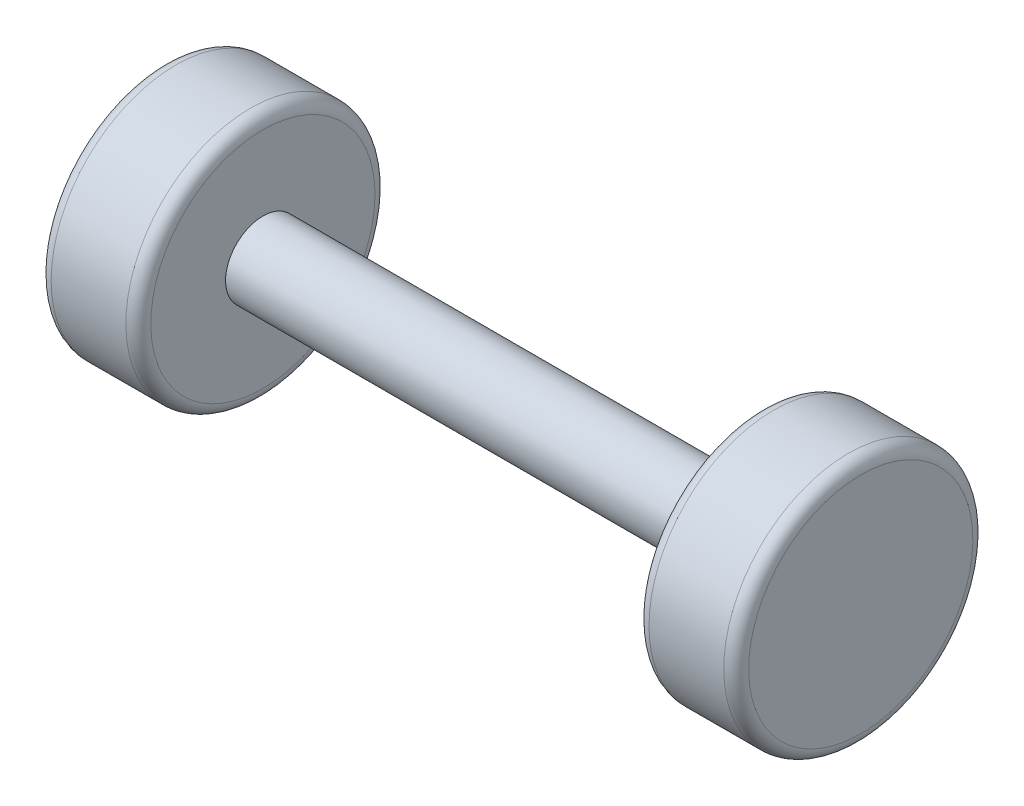
ISO-10303-21;
HEADER;
FILE_DESCRIPTION(('STEP AP214'),'2;1');
FILE_NAME('part.step','',(''),(''),'','','');
FILE_SCHEMA(('AUTOMOTIVE_DESIGN { 1 0 10303 214 1 1 1 1 }'));
ENDSEC;
DATA;
#1=APPLICATION_CONTEXT('core data for automotive mechanical design processes');
#2=APPLICATION_PROTOCOL_DEFINITION('international standard','automotive_design',2000,#1);
#3=PRODUCT_CONTEXT('',#1,'mechanical');
#4=PRODUCT('Part','Part','',(#3));
#5=PRODUCT_RELATED_PRODUCT_CATEGORY('part','',(#4));
#6=PRODUCT_DEFINITION_FORMATION('','',#4);
#7=PRODUCT_DEFINITION_CONTEXT('part definition',#1,'design');
#8=PRODUCT_DEFINITION('design','',#6,#7);
#9=PRODUCT_DEFINITION_SHAPE('','',#8);
#10=(LENGTH_UNIT() NAMED_UNIT(*) SI_UNIT(.MILLI.,.METRE.));
#11=(NAMED_UNIT(*) PLANE_ANGLE_UNIT() SI_UNIT($,.RADIAN.));
#12=(NAMED_UNIT(*) SI_UNIT($,.STERADIAN.) SOLID_ANGLE_UNIT());
#13=UNCERTAINTY_MEASURE_WITH_UNIT(LENGTH_MEASURE(1.E-05),#10,'distance_accuracy_value','');
#14=(GEOMETRIC_REPRESENTATION_CONTEXT(3) GLOBAL_UNCERTAINTY_ASSIGNED_CONTEXT((#13)) GLOBAL_UNIT_ASSIGNED_CONTEXT((#10,
#11,#12)) REPRESENTATION_CONTEXT('',''));
#15=CARTESIAN_POINT('',(0.,0.,0.));
#16=DIRECTION('',(0.,0.,1.));
#17=DIRECTION('',(1.,0.,0.));
#18=AXIS2_PLACEMENT_3D('',#15,#16,#17);
#19=CARTESIAN_POINT('',(0.,0.,0.));
#20=DIRECTION('',(1.,0.,0.));
#21=DIRECTION('',(0.,1.,0.));
#22=AXIS2_PLACEMENT_3D('',#19,#20,#21);
#23=CYLINDRICAL_SURFACE('',#22,15.);
#24=CARTESIAN_POINT('',(-100.,0.,0.));
#25=DIRECTION('',(1.,0.,0.));
#26=DIRECTION('',(0.,1.,0.));
#27=AXIS2_PLACEMENT_3D('',#24,#25,#26);
#28=CIRCLE('',#27,15.);
#29=CARTESIAN_POINT('',(-100.,15.,0.));
#30=VERTEX_POINT('',#29);
#31=EDGE_CURVE('E63',#30,#30,#28,.T.);
#32=ORIENTED_EDGE('',*,*,#31,.T.);
#33=EDGE_LOOP('',(#32));
#34=FACE_BOUND('',#33,.T.);
#35=CARTESIAN_POINT('',(100.,0.,0.));
#36=DIRECTION('',(1.,0.,0.));
#37=DIRECTION('',(0.,1.,0.));
#38=AXIS2_PLACEMENT_3D('',#35,#36,#37);
#39=CIRCLE('',#38,15.);
#40=CARTESIAN_POINT('',(100.,15.,0.));
#41=VERTEX_POINT('',#40);
#42=EDGE_CURVE('E66',#41,#41,#39,.T.);
#43=ORIENTED_EDGE('',*,*,#42,.F.);
#44=EDGE_LOOP('',(#43));
#45=FACE_BOUND('',#44,.T.);
#46=ADVANCED_FACE('F31',(#34,#45),#23,.T.);
#47=CARTESIAN_POINT('',(-100.,50.,0.));
#48=DIRECTION('',(1.,0.,0.));
#49=DIRECTION('',(0.,1.,0.));
#50=AXIS2_PLACEMENT_3D('',#47,#48,#49);
#51=PLANE('',#50);
#52=CARTESIAN_POINT('',(-100.,0.,0.));
#53=DIRECTION('',(1.,0.,0.));
#54=DIRECTION('',(0.,1.,0.));
#55=AXIS2_PLACEMENT_3D('',#52,#53,#54);
#56=CIRCLE('',#55,45.);
#57=CARTESIAN_POINT('',(-100.,45.,0.));
#58=VERTEX_POINT('',#57);
#59=EDGE_CURVE('E51',#58,#58,#56,.T.);
#60=ORIENTED_EDGE('',*,*,#59,.T.);
#61=EDGE_LOOP('',(#60));
#62=FACE_BOUND('',#61,.T.);
#63=ORIENTED_EDGE('',*,*,#31,.F.);
#64=EDGE_LOOP('',(#63));
#65=FACE_BOUND('',#64,.T.);
#66=ADVANCED_FACE('F73',(#62,#65),#51,.T.);
#67=CARTESIAN_POINT('',(0.,0.,0.));
#68=DIRECTION('',(1.,0.,0.));
#69=DIRECTION('',(0.,1.,0.));
#70=AXIS2_PLACEMENT_3D('',#67,#68,#69);
#71=CYLINDRICAL_SURFACE('',#70,50.);
#72=CARTESIAN_POINT('',(-135.,0.,0.));
#73=DIRECTION('',(-1.,0.,0.));
#74=DIRECTION('',(0.,-1.,0.));
#75=AXIS2_PLACEMENT_3D('',#72,#73,#74);
#76=CIRCLE('',#75,50.);
#77=CARTESIAN_POINT('',(-135.,-50.,0.));
#78=VERTEX_POINT('',#77);
#79=EDGE_CURVE('E57',#78,#78,#76,.F.);
#80=ORIENTED_EDGE('',*,*,#79,.T.);
#81=EDGE_LOOP('',(#80));
#82=FACE_BOUND('',#81,.T.);
#83=CARTESIAN_POINT('',(-105.,0.,0.));
#84=DIRECTION('',(1.,0.,0.));
#85=DIRECTION('',(0.,1.,0.));
#86=AXIS2_PLACEMENT_3D('',#83,#84,#85);
#87=CIRCLE('',#86,50.);
#88=CARTESIAN_POINT('',(-105.,50.,0.));
#89=VERTEX_POINT('',#88);
#90=EDGE_CURVE('E60',#89,#89,#87,.F.);
#91=ORIENTED_EDGE('',*,*,#90,.T.);
#92=EDGE_LOOP('',(#91));
#93=FACE_BOUND('',#92,.T.);
#94=ADVANCED_FACE('F79',(#82,#93),#71,.T.);
#95=CARTESIAN_POINT('',(-140.,50.,0.));
#96=DIRECTION('',(-1.,0.,0.));
#97=DIRECTION('',(0.,-1.,0.));
#98=AXIS2_PLACEMENT_3D('',#95,#96,#97);
#99=PLANE('',#98);
#100=CARTESIAN_POINT('',(-140.,0.,0.));
#101=DIRECTION('',(-1.,0.,0.));
#102=DIRECTION('',(0.,-1.,0.));
#103=AXIS2_PLACEMENT_3D('',#100,#101,#102);
#104=CIRCLE('',#103,45.);
#105=CARTESIAN_POINT('',(-140.,-45.,0.));
#106=VERTEX_POINT('',#105);
#107=EDGE_CURVE('E54',#106,#106,#104,.T.);
#108=ORIENTED_EDGE('',*,*,#107,.T.);
#109=EDGE_LOOP('',(#108));
#110=FACE_BOUND('',#109,.T.);
#111=ADVANCED_FACE('F113',(#110),#99,.T.);
#112=CARTESIAN_POINT('',(100.,50.,0.));
#113=DIRECTION('',(-1.,0.,0.));
#114=DIRECTION('',(0.,1.,0.));
#115=AXIS2_PLACEMENT_3D('',#112,#113,#114);
#116=PLANE('',#115);
#117=CARTESIAN_POINT('',(100.,0.,0.));
#118=DIRECTION('',(-1.,0.,0.));
#119=DIRECTION('',(0.,-1.,0.));
#120=AXIS2_PLACEMENT_3D('',#117,#118,#119);
#121=CIRCLE('',#120,45.);
#122=CARTESIAN_POINT('',(100.,-45.,0.));
#123=VERTEX_POINT('',#122);
#124=EDGE_CURVE('E38',#123,#123,#121,.T.);
#125=ORIENTED_EDGE('',*,*,#124,.T.);
#126=EDGE_LOOP('',(#125));
#127=FACE_BOUND('',#126,.T.);
#128=ORIENTED_EDGE('',*,*,#42,.T.);
#129=EDGE_LOOP('',(#128));
#130=FACE_BOUND('',#129,.T.);
#131=ADVANCED_FACE('F70',(#127,#130),#116,.T.);
#132=CARTESIAN_POINT('',(0.,0.,0.));
#133=DIRECTION('',(-1.,0.,0.));
#134=DIRECTION('',(0.,1.,0.));
#135=AXIS2_PLACEMENT_3D('',#132,#133,#134);
#136=CYLINDRICAL_SURFACE('',#135,50.);
#137=CARTESIAN_POINT('',(105.,0.,0.));
#138=DIRECTION('',(-1.,0.,0.));
#139=DIRECTION('',(0.,-1.,0.));
#140=AXIS2_PLACEMENT_3D('',#137,#138,#139);
#141=CIRCLE('',#140,50.);
#142=CARTESIAN_POINT('',(105.,-50.,0.));
#143=VERTEX_POINT('',#142);
#144=EDGE_CURVE('E42',#143,#143,#141,.F.);
#145=ORIENTED_EDGE('',*,*,#144,.T.);
#146=EDGE_LOOP('',(#145));
#147=FACE_BOUND('',#146,.T.);
#148=CARTESIAN_POINT('',(135.,0.,0.));
#149=DIRECTION('',(1.,0.,0.));
#150=DIRECTION('',(0.,1.,0.));
#151=AXIS2_PLACEMENT_3D('',#148,#149,#150);
#152=CIRCLE('',#151,50.);
#153=CARTESIAN_POINT('',(135.,50.,0.));
#154=VERTEX_POINT('',#153);
#155=EDGE_CURVE('E46',#154,#154,#152,.F.);
#156=ORIENTED_EDGE('',*,*,#155,.T.);
#157=EDGE_LOOP('',(#156));
#158=FACE_BOUND('',#157,.T.);
#159=ADVANCED_FACE('F102',(#147,#158),#136,.T.);
#160=CARTESIAN_POINT('',(140.,50.,0.));
#161=DIRECTION('',(1.,0.,0.));
#162=DIRECTION('',(0.,-1.,0.));
#163=AXIS2_PLACEMENT_3D('',#160,#161,#162);
#164=PLANE('',#163);
#165=CARTESIAN_POINT('',(140.,0.,0.));
#166=DIRECTION('',(1.,0.,0.));
#167=DIRECTION('',(0.,1.,0.));
#168=AXIS2_PLACEMENT_3D('',#165,#166,#167);
#169=CIRCLE('',#168,45.);
#170=CARTESIAN_POINT('',(140.,45.,0.));
#171=VERTEX_POINT('',#170);
#172=EDGE_CURVE('E10',#171,#171,#169,.T.);
#173=ORIENTED_EDGE('',*,*,#172,.T.);
#174=EDGE_LOOP('',(#173));
#175=FACE_BOUND('',#174,.T.);
#176=ADVANCED_FACE('F88',(#175),#164,.T.);
#177=CARTESIAN_POINT('',(-135.,0.,0.));
#178=DIRECTION('',(-1.,0.,0.));
#179=DIRECTION('',(0.,-1.,0.));
#180=AXIS2_PLACEMENT_3D('',#177,#178,#179);
#181=TOROIDAL_SURFACE('',#180,45.,5.);
#182=ORIENTED_EDGE('',*,*,#107,.F.);
#183=EDGE_LOOP('',(#182));
#184=FACE_BOUND('',#183,.T.);
#185=ORIENTED_EDGE('',*,*,#79,.F.);
#186=EDGE_LOOP('',(#185));
#187=FACE_BOUND('',#186,.T.);
#188=ADVANCED_FACE('F84',(#184,#187),#181,.T.);
#189=CARTESIAN_POINT('',(-105.,0.,0.));
#190=DIRECTION('',(1.,0.,0.));
#191=DIRECTION('',(0.,1.,0.));
#192=AXIS2_PLACEMENT_3D('',#189,#190,#191);
#193=TOROIDAL_SURFACE('',#192,45.,5.);
#194=ORIENTED_EDGE('',*,*,#90,.F.);
#195=EDGE_LOOP('',(#194));
#196=FACE_BOUND('',#195,.T.);
#197=ORIENTED_EDGE('',*,*,#59,.F.);
#198=EDGE_LOOP('',(#197));
#199=FACE_BOUND('',#198,.T.);
#200=ADVANCED_FACE('F87',(#196,#199),#193,.T.);
#201=CARTESIAN_POINT('',(105.,0.,0.));
#202=DIRECTION('',(-1.,0.,0.));
#203=DIRECTION('',(0.,-1.,0.));
#204=AXIS2_PLACEMENT_3D('',#201,#202,#203);
#205=TOROIDAL_SURFACE('',#204,45.,5.);
#206=ORIENTED_EDGE('',*,*,#124,.F.);
#207=EDGE_LOOP('',(#206));
#208=FACE_BOUND('',#207,.T.);
#209=ORIENTED_EDGE('',*,*,#144,.F.);
#210=EDGE_LOOP('',(#209));
#211=FACE_BOUND('',#210,.T.);
#212=ADVANCED_FACE('F91',(#208,#211),#205,.T.);
#213=CARTESIAN_POINT('',(135.,0.,0.));
#214=DIRECTION('',(1.,0.,0.));
#215=DIRECTION('',(0.,1.,0.));
#216=AXIS2_PLACEMENT_3D('',#213,#214,#215);
#217=TOROIDAL_SURFACE('',#216,45.,5.);
#218=ORIENTED_EDGE('',*,*,#155,.F.);
#219=EDGE_LOOP('',(#218));
#220=FACE_BOUND('',#219,.T.);
#221=ORIENTED_EDGE('',*,*,#172,.F.);
#222=EDGE_LOOP('',(#221));
#223=FACE_BOUND('',#222,.T.);
#224=ADVANCED_FACE('F33',(#220,#223),#217,.T.);
#225=CLOSED_SHELL('',(#46,#66,#94,#111,#131,#159,#176,#188,#200,#212,#224));
#226=MANIFOLD_SOLID_BREP('B2',#225);
#227=ADVANCED_BREP_SHAPE_REPRESENTATION('',(#18,#226),#14);
#228=SHAPE_DEFINITION_REPRESENTATION(#9,#227);
ENDSEC;
END-ISO-10303-21;
